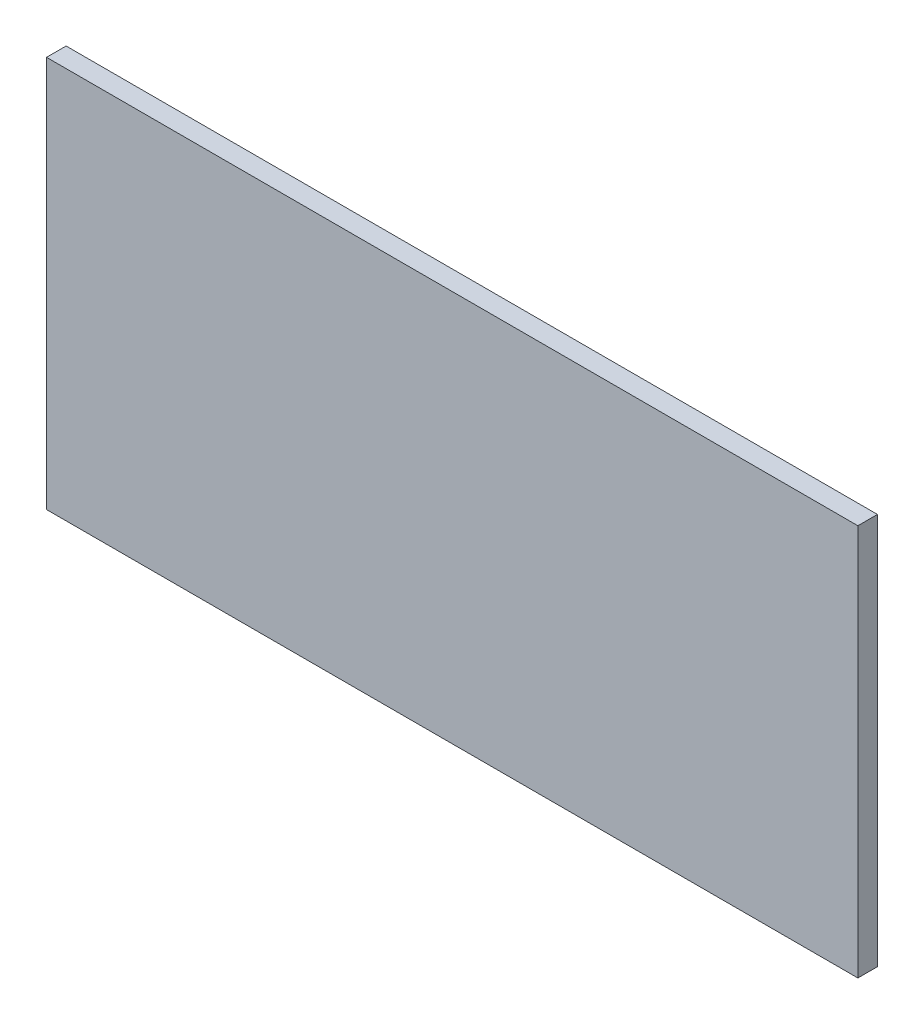
ISO-10303-21;
HEADER;
FILE_DESCRIPTION(('STEP AP214'),'2;1');
FILE_NAME('part.step','',(''),(''),'','','');
FILE_SCHEMA(('AUTOMOTIVE_DESIGN { 1 0 10303 214 1 1 1 1 }'));
ENDSEC;
DATA;
#1=APPLICATION_CONTEXT('core data for automotive mechanical design processes');
#2=APPLICATION_PROTOCOL_DEFINITION('international standard','automotive_design',2000,#1);
#3=PRODUCT_CONTEXT('',#1,'mechanical');
#4=PRODUCT('Part','Part','',(#3));
#5=PRODUCT_RELATED_PRODUCT_CATEGORY('part','',(#4));
#6=PRODUCT_DEFINITION_FORMATION('','',#4);
#7=PRODUCT_DEFINITION_CONTEXT('part definition',#1,'design');
#8=PRODUCT_DEFINITION('design','',#6,#7);
#9=PRODUCT_DEFINITION_SHAPE('','',#8);
#10=(LENGTH_UNIT() NAMED_UNIT(*) SI_UNIT(.MILLI.,.METRE.));
#11=(NAMED_UNIT(*) PLANE_ANGLE_UNIT() SI_UNIT($,.RADIAN.));
#12=(NAMED_UNIT(*) SI_UNIT($,.STERADIAN.) SOLID_ANGLE_UNIT());
#13=UNCERTAINTY_MEASURE_WITH_UNIT(LENGTH_MEASURE(1.E-05),#10,'distance_accuracy_value','');
#14=(GEOMETRIC_REPRESENTATION_CONTEXT(3) GLOBAL_UNCERTAINTY_ASSIGNED_CONTEXT((#13)) GLOBAL_UNIT_ASSIGNED_CONTEXT((#10,
#11,#12)) REPRESENTATION_CONTEXT('',''));
#15=CARTESIAN_POINT('',(0.,0.,0.));
#16=DIRECTION('',(0.,0.,1.));
#17=DIRECTION('',(1.,0.,0.));
#18=AXIS2_PLACEMENT_3D('',#15,#16,#17);
#19=CARTESIAN_POINT('',(89.7,-140.315,1.635));
#20=DIRECTION('',(0.,0.,-1.));
#21=DIRECTION('',(0.,-1.,0.));
#22=AXIS2_PLACEMENT_3D('',#19,#20,#21);
#23=PLANE('',#22);
#24=DIRECTION('',(0.,-1.,0.));
#25=VECTOR('',#24,1.);
#26=CARTESIAN_POINT('',(90.425,-139.965,1.635));
#27=LINE('',#26,#25);
#28=CARTESIAN_POINT('',(90.425,-139.965,1.635));
#29=VERTEX_POINT('',#28);
#30=CARTESIAN_POINT('',(90.425,-140.665,1.635));
#31=VERTEX_POINT('',#30);
#32=EDGE_CURVE('E20',#29,#31,#27,.T.);
#33=ORIENTED_EDGE('',*,*,#32,.F.);
#34=DIRECTION('',(1.,0.,0.));
#35=VECTOR('',#34,1.);
#36=CARTESIAN_POINT('',(88.975,-139.965,1.635));
#37=LINE('',#36,#35);
#38=CARTESIAN_POINT('',(88.975,-139.965,1.635));
#39=VERTEX_POINT('',#38);
#40=EDGE_CURVE('E106',#39,#29,#37,.T.);
#41=ORIENTED_EDGE('',*,*,#40,.F.);
#42=DIRECTION('',(0.,1.,0.));
#43=VECTOR('',#42,1.);
#44=CARTESIAN_POINT('',(88.975,-140.665,1.635));
#45=LINE('',#44,#43);
#46=CARTESIAN_POINT('',(88.975,-140.665,1.635));
#47=VERTEX_POINT('',#46);
#48=EDGE_CURVE('E69',#47,#39,#45,.T.);
#49=ORIENTED_EDGE('',*,*,#48,.F.);
#50=DIRECTION('',(-1.,0.,0.));
#51=VECTOR('',#50,1.);
#52=CARTESIAN_POINT('',(90.425,-140.665,1.635));
#53=LINE('',#52,#51);
#54=EDGE_CURVE('E95',#31,#47,#53,.T.);
#55=ORIENTED_EDGE('',*,*,#54,.F.);
#56=EDGE_LOOP('',(#33,#41,#49,#55));
#57=FACE_BOUND('',#56,.T.);
#58=ADVANCED_FACE('F17',(#57),#23,.F.);
#59=CARTESIAN_POINT('',(89.7,-140.315,1.6));
#60=DIRECTION('',(0.,0.,-1.));
#61=DIRECTION('',(0.,-1.,0.));
#62=AXIS2_PLACEMENT_3D('',#59,#60,#61);
#63=PLANE('',#62);
#64=DIRECTION('',(-1.,0.,0.));
#65=VECTOR('',#64,1.);
#66=CARTESIAN_POINT('',(90.425,-140.665,1.6));
#67=LINE('',#66,#65);
#68=CARTESIAN_POINT('',(90.425,-140.665,1.6));
#69=VERTEX_POINT('',#68);
#70=CARTESIAN_POINT('',(88.975,-140.665,1.6));
#71=VERTEX_POINT('',#70);
#72=EDGE_CURVE('E81',#69,#71,#67,.T.);
#73=ORIENTED_EDGE('',*,*,#72,.T.);
#74=DIRECTION('',(0.,1.,0.));
#75=VECTOR('',#74,1.);
#76=CARTESIAN_POINT('',(88.975,-140.665,1.6));
#77=LINE('',#76,#75);
#78=CARTESIAN_POINT('',(88.975,-139.965,1.6));
#79=VERTEX_POINT('',#78);
#80=EDGE_CURVE('E62',#71,#79,#77,.T.);
#81=ORIENTED_EDGE('',*,*,#80,.T.);
#82=DIRECTION('',(1.,0.,0.));
#83=VECTOR('',#82,1.);
#84=CARTESIAN_POINT('',(88.975,-139.965,1.6));
#85=LINE('',#84,#83);
#86=CARTESIAN_POINT('',(90.425,-139.965,1.6));
#87=VERTEX_POINT('',#86);
#88=EDGE_CURVE('E83',#79,#87,#85,.T.);
#89=ORIENTED_EDGE('',*,*,#88,.T.);
#90=DIRECTION('',(0.,-1.,0.));
#91=VECTOR('',#90,1.);
#92=CARTESIAN_POINT('',(90.425,-139.965,1.6));
#93=LINE('',#92,#91);
#94=EDGE_CURVE('E11',#87,#69,#93,.T.);
#95=ORIENTED_EDGE('',*,*,#94,.T.);
#96=EDGE_LOOP('',(#73,#81,#89,#95));
#97=FACE_BOUND('',#96,.T.);
#98=ADVANCED_FACE('F80',(#97),#63,.T.);
#99=CARTESIAN_POINT('',(90.425,-139.965,1.6));
#100=DIRECTION('',(1.,0.,0.));
#101=DIRECTION('',(0.,1.,0.));
#102=AXIS2_PLACEMENT_3D('',#99,#100,#101);
#103=PLANE('',#102);
#104=DIRECTION('',(0.,0.,1.));
#105=VECTOR('',#104,1.);
#106=CARTESIAN_POINT('',(90.425,-139.965,1.6));
#107=LINE('',#106,#105);
#108=EDGE_CURVE('E104',#87,#29,#107,.T.);
#109=ORIENTED_EDGE('',*,*,#108,.T.);
#110=ORIENTED_EDGE('',*,*,#32,.T.);
#111=DIRECTION('',(0.,0.,1.));
#112=VECTOR('',#111,1.);
#113=CARTESIAN_POINT('',(90.425,-140.665,1.6));
#114=LINE('',#113,#112);
#115=EDGE_CURVE('E89',#69,#31,#114,.T.);
#116=ORIENTED_EDGE('',*,*,#115,.F.);
#117=ORIENTED_EDGE('',*,*,#94,.F.);
#118=EDGE_LOOP('',(#109,#110,#116,#117));
#119=FACE_BOUND('',#118,.T.);
#120=ADVANCED_FACE('F93',(#119),#103,.T.);
#121=CARTESIAN_POINT('',(88.975,-139.965,1.6));
#122=DIRECTION('',(0.,1.,0.));
#123=DIRECTION('',(1.,0.,0.));
#124=AXIS2_PLACEMENT_3D('',#121,#122,#123);
#125=PLANE('',#124);
#126=DIRECTION('',(0.,0.,1.));
#127=VECTOR('',#126,1.);
#128=CARTESIAN_POINT('',(88.975,-139.965,1.6));
#129=LINE('',#128,#127);
#130=EDGE_CURVE('E107',#79,#39,#129,.T.);
#131=ORIENTED_EDGE('',*,*,#130,.T.);
#132=ORIENTED_EDGE('',*,*,#40,.T.);
#133=ORIENTED_EDGE('',*,*,#108,.F.);
#134=ORIENTED_EDGE('',*,*,#88,.F.);
#135=EDGE_LOOP('',(#131,#132,#133,#134));
#136=FACE_BOUND('',#135,.T.);
#137=ADVANCED_FACE('F125',(#136),#125,.T.);
#138=CARTESIAN_POINT('',(88.975,-140.665,1.6));
#139=DIRECTION('',(-1.,0.,0.));
#140=DIRECTION('',(0.,0.,1.));
#141=AXIS2_PLACEMENT_3D('',#138,#139,#140);
#142=PLANE('',#141);
#143=DIRECTION('',(0.,0.,1.));
#144=VECTOR('',#143,1.);
#145=CARTESIAN_POINT('',(88.975,-140.665,1.6));
#146=LINE('',#145,#144);
#147=EDGE_CURVE('E90',#71,#47,#146,.T.);
#148=ORIENTED_EDGE('',*,*,#147,.T.);
#149=ORIENTED_EDGE('',*,*,#48,.T.);
#150=ORIENTED_EDGE('',*,*,#130,.F.);
#151=ORIENTED_EDGE('',*,*,#80,.F.);
#152=EDGE_LOOP('',(#148,#149,#150,#151));
#153=FACE_BOUND('',#152,.T.);
#154=ADVANCED_FACE('F126',(#153),#142,.T.);
#155=CARTESIAN_POINT('',(90.425,-140.665,1.6));
#156=DIRECTION('',(0.,-1.,0.));
#157=DIRECTION('',(0.,0.,-1.));
#158=AXIS2_PLACEMENT_3D('',#155,#156,#157);
#159=PLANE('',#158);
#160=ORIENTED_EDGE('',*,*,#115,.T.);
#161=ORIENTED_EDGE('',*,*,#54,.T.);
#162=ORIENTED_EDGE('',*,*,#147,.F.);
#163=ORIENTED_EDGE('',*,*,#72,.F.);
#164=EDGE_LOOP('',(#160,#161,#162,#163));
#165=FACE_BOUND('',#164,.T.);
#166=ADVANCED_FACE('F87',(#165),#159,.T.);
#167=CLOSED_SHELL('',(#58,#98,#120,#137,#154,#166));
#168=MANIFOLD_SOLID_BREP('B1',#167);
#169=ADVANCED_BREP_SHAPE_REPRESENTATION('',(#18,#168),#14);
#170=SHAPE_DEFINITION_REPRESENTATION(#9,#169);
ENDSEC;
END-ISO-10303-21;
